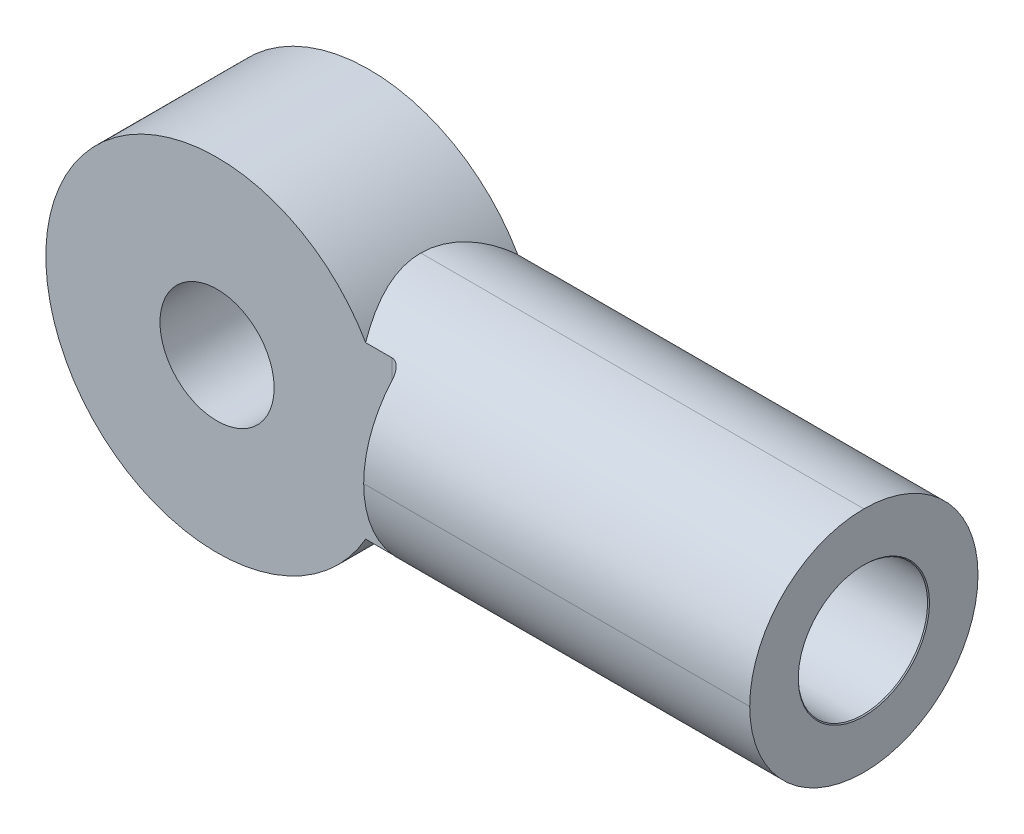
ISO-10303-21;
HEADER;
FILE_DESCRIPTION(('STEP AP214'),'2;1');
FILE_NAME('part.step','',(''),(''),'','','');
FILE_SCHEMA(('AUTOMOTIVE_DESIGN { 1 0 10303 214 1 1 1 1 }'));
ENDSEC;
DATA;
#1=APPLICATION_CONTEXT('core data for automotive mechanical design processes');
#2=APPLICATION_PROTOCOL_DEFINITION('international standard','automotive_design',2000,#1);
#3=PRODUCT_CONTEXT('',#1,'mechanical');
#4=PRODUCT('Part','Part','',(#3));
#5=PRODUCT_RELATED_PRODUCT_CATEGORY('part','',(#4));
#6=PRODUCT_DEFINITION_FORMATION('','',#4);
#7=PRODUCT_DEFINITION_CONTEXT('part definition',#1,'design');
#8=PRODUCT_DEFINITION('design','',#6,#7);
#9=PRODUCT_DEFINITION_SHAPE('','',#8);
#10=(LENGTH_UNIT() NAMED_UNIT(*) SI_UNIT(.MILLI.,.METRE.));
#11=(NAMED_UNIT(*) PLANE_ANGLE_UNIT() SI_UNIT($,.RADIAN.));
#12=(NAMED_UNIT(*) SI_UNIT($,.STERADIAN.) SOLID_ANGLE_UNIT());
#13=UNCERTAINTY_MEASURE_WITH_UNIT(LENGTH_MEASURE(1.E-05),#10,'distance_accuracy_value','');
#14=(GEOMETRIC_REPRESENTATION_CONTEXT(3) GLOBAL_UNCERTAINTY_ASSIGNED_CONTEXT((#13)) GLOBAL_UNIT_ASSIGNED_CONTEXT((#10,
#11,#12)) REPRESENTATION_CONTEXT('',''));
#15=CARTESIAN_POINT('',(0.,0.,0.));
#16=DIRECTION('',(0.,0.,1.));
#17=DIRECTION('',(1.,0.,0.));
#18=AXIS2_PLACEMENT_3D('',#15,#16,#17);
#19=CARTESIAN_POINT('',(0.,0.,6.));
#20=DIRECTION('',(0.,0.,-1.));
#21=DIRECTION('',(-1.,0.,0.));
#22=AXIS2_PLACEMENT_3D('',#19,#20,#21);
#23=CYLINDRICAL_SURFACE('',#22,4.5);
#24=CARTESIAN_POINT('',(0.,0.,1.));
#25=DIRECTION('',(0.,0.,-1.));
#26=DIRECTION('',(-1.,0.,0.));
#27=AXIS2_PLACEMENT_3D('',#24,#25,#26);
#28=CIRCLE('',#27,4.5);
#29=CARTESIAN_POINT('',(3.90512483795332,-2.23606797749979,1.));
#30=VERTEX_POINT('',#29);
#31=CARTESIAN_POINT('',(3.90512483795332,2.23606797749979,1.));
#32=VERTEX_POINT('',#31);
#33=EDGE_CURVE('E135',#30,#32,#28,.T.);
#34=ORIENTED_EDGE('',*,*,#33,.F.);
#35=CARTESIAN_POINT('',(3.90512483795332,-2.23606797749979,1.));
#36=CARTESIAN_POINT('',(3.87430248363081,-2.28990152814688,1.06021097202553));
#37=CARTESIAN_POINT('',(3.84340433414663,-2.3412741824826,1.12251861210551));
#38=CARTESIAN_POINT('',(3.78214828029025,-2.43899226804182,1.25131912936951));
#39=CARTESIAN_POINT('',(3.75179095016979,-2.48533259418797,1.31781615044173));
#40=CARTESIAN_POINT('',(3.66210321766203,-2.61731713514297,1.52468528722313));
#41=CARTESIAN_POINT('',(3.60476747014611,-2.6949001467601,1.67129505511275));
#42=CARTESIAN_POINT('',(3.51242978153191,-2.81379502124337,1.95063380048268));
#43=CARTESIAN_POINT('',(3.47525883130887,-2.85915891224902,2.08092816257066));
#44=CARTESIAN_POINT('',(3.41426811351215,-2.93173203603866,2.34885401161128));
#45=CARTESIAN_POINT('',(3.39036629206293,-2.95905304662755,2.48643450948373));
#46=CARTESIAN_POINT('',(3.36804353651592,-2.98435520758396,2.68772903446459));
#47=CARTESIAN_POINT('',(3.36284662191855,-2.99020103959435,2.7498104304557));
#48=CARTESIAN_POINT('',(3.3558646642643,-2.99803063464936,2.87458147311398));
#49=CARTESIAN_POINT('',(3.35408925235831,-3.00000349600086,2.93727233897236));
#50=CARTESIAN_POINT('',(3.35410196624968,-3.,3.));
#51=B_SPLINE_CURVE_WITH_KNOTS('',3,(#35,#36,#37,#38,#39,#40,#41,#42,#43,#44,#45,#46,#47,#48,#49,
#50),.UNSPECIFIED.,.F.,.F.,(4,2,2,2,2,2,2,4),(0.,0.259192052303657,0.518644634574339,
1.0424505897874,1.46954941047818,1.89397684264271,2.08150715622094,2.26956458020267),.UNSPECIFIED.);
#52=CARTESIAN_POINT('',(3.35410196624968,-3.,3.));
#53=VERTEX_POINT('',#52);
#54=EDGE_CURVE('E177',#30,#53,#51,.T.);
#55=ORIENTED_EDGE('',*,*,#54,.T.);
#56=CARTESIAN_POINT('',(3.35410196624968,-3.,3.));
#57=CARTESIAN_POINT('',(3.35406133264124,-3.0000192740159,3.07374160363224));
#58=CARTESIAN_POINT('',(3.35653275849281,-2.99728197493711,3.14745806667561));
#59=CARTESIAN_POINT('',(3.36618733199912,-2.9864488408589,3.29409104298593));
#60=CARTESIAN_POINT('',(3.37336425537169,-2.97836008446859,3.36700848380756));
#61=CARTESIAN_POINT('',(3.39202769480024,-2.9570819405099,3.51078892742276));
#62=CARTESIAN_POINT('',(3.40347159634914,-2.94394295107167,3.5816650169798));
#63=CARTESIAN_POINT('',(3.43015977984038,-2.91280377718486,3.72160692841399));
#64=CARTESIAN_POINT('',(3.44540509067008,-2.89480227654162,3.79067225458879));
#65=CARTESIAN_POINT('',(3.49579062406979,-2.83411412242887,3.99382096509364));
#66=CARTESIAN_POINT('',(3.53570725678305,-2.78460861981225,4.12473745273625));
#67=CARTESIAN_POINT('',(3.62363754406646,-2.6691774009434,4.3765059287876));
#68=CARTESIAN_POINT('',(3.67167461758368,-2.60320392183895,4.4973272528491));
#69=CARTESIAN_POINT('',(3.75141446899956,-2.48590317502807,4.6813533648933));
#70=CARTESIAN_POINT('',(3.78191749005986,-2.43935515287485,4.74818918579343));
#71=CARTESIAN_POINT('',(3.84335262840594,-2.3413619099754,4.87737899798922));
#72=CARTESIAN_POINT('',(3.87428195110304,-2.28994150579089,4.93975313266782));
#73=CARTESIAN_POINT('',(3.90512483795333,-2.23606797749979,5.));
#74=B_SPLINE_CURVE_WITH_KNOTS('',3,(#56,#57,#58,#59,#60,#61,#62,#63,#64,#65,#66,#67,#68,#69,#70,
#71,#72,#73),.UNSPECIFIED.,.F.,.F.,(4,2,2,2,2,2,2,2,4),(0.,0.221092162055901,0.441892458879527,
0.660544234322296,0.879255254295149,1.31401306963559,1.75004679072101,2.01073314368504,
2.27015661919764),.UNSPECIFIED.);
#75=CARTESIAN_POINT('',(3.90512483795333,-2.23606797749979,5.));
#76=VERTEX_POINT('',#75);
#77=EDGE_CURVE('E168',#53,#76,#74,.T.);
#78=ORIENTED_EDGE('',*,*,#77,.T.);
#79=CARTESIAN_POINT('',(0.,0.,5.));
#80=DIRECTION('',(0.,0.,1.));
#81=DIRECTION('',(1.,0.,0.));
#82=AXIS2_PLACEMENT_3D('',#79,#80,#81);
#83=CIRCLE('',#82,4.5);
#84=CARTESIAN_POINT('',(3.90512483795333,2.23606797749979,5.));
#85=VERTEX_POINT('',#84);
#86=EDGE_CURVE('E137',#85,#76,#83,.T.);
#87=ORIENTED_EDGE('',*,*,#86,.F.);
#88=CARTESIAN_POINT('',(3.90512483795333,2.23606797749979,5.));
#89=CARTESIAN_POINT('',(3.87430248363081,2.28990152814687,4.93978902797447));
#90=CARTESIAN_POINT('',(3.84340433414664,2.34127418248259,4.87748138789449));
#91=CARTESIAN_POINT('',(3.78214828029026,2.43899226804181,4.74868087063049));
#92=CARTESIAN_POINT('',(3.7517909501698,2.48533259418797,4.68218384955827));
#93=CARTESIAN_POINT('',(3.66210321766203,2.61731713514296,4.47531471277687));
#94=CARTESIAN_POINT('',(3.60476747014612,2.69490014676009,4.32870494488725));
#95=CARTESIAN_POINT('',(3.51242978153192,2.81379502124337,4.04936619951732));
#96=CARTESIAN_POINT('',(3.47525883130887,2.85915891224901,3.91907183742934));
#97=CARTESIAN_POINT('',(3.41426811351216,2.93173203603865,3.65114598838872));
#98=CARTESIAN_POINT('',(3.39036629206293,2.95905304662754,3.51356549051627));
#99=CARTESIAN_POINT('',(3.36804353651592,2.98435520758395,3.31227096553541));
#100=CARTESIAN_POINT('',(3.36284662191855,2.99020103959434,3.2501895695443));
#101=CARTESIAN_POINT('',(3.35586466426431,2.99803063464935,3.12541852688602));
#102=CARTESIAN_POINT('',(3.35408925235832,3.00000349600085,3.06272766102764));
#103=CARTESIAN_POINT('',(3.35410196624969,3.,3.));
#104=B_SPLINE_CURVE_WITH_KNOTS('',3,(#88,#89,#90,#91,#92,#93,#94,#95,#96,#97,#98,#99,#100,#101,
#102,#103),.UNSPECIFIED.,.F.,.F.,(4,2,2,2,2,2,2,4),(0.,0.259192052303656,0.51864463457434,
1.0424505897874,1.46954941047818,1.89397684264271,2.08150715622094,2.26956458020267),.UNSPECIFIED.);
#105=CARTESIAN_POINT('',(3.35410196624968,3.,3.));
#106=VERTEX_POINT('',#105);
#107=EDGE_CURVE('E237',#85,#106,#104,.T.);
#108=ORIENTED_EDGE('',*,*,#107,.T.);
#109=CARTESIAN_POINT('',(3.35410196624968,3.,3.));
#110=CARTESIAN_POINT('',(3.35406133264124,3.00001927401591,2.92625839636776));
#111=CARTESIAN_POINT('',(3.3565327584928,2.99728197493712,2.85254193332438));
#112=CARTESIAN_POINT('',(3.36618733199911,2.9864488408589,2.70590895701407));
#113=CARTESIAN_POINT('',(3.37336425537169,2.97836008446859,2.63299151619244));
#114=CARTESIAN_POINT('',(3.39202769480023,2.95708194050991,2.48921107257724));
#115=CARTESIAN_POINT('',(3.40347159634914,2.94394295107168,2.4183349830202));
#116=CARTESIAN_POINT('',(3.43015977984038,2.91280377718486,2.27839307158601));
#117=CARTESIAN_POINT('',(3.44540509067007,2.89480227654162,2.20932774541121));
#118=CARTESIAN_POINT('',(3.49579062406979,2.83411412242888,2.00617903490636));
#119=CARTESIAN_POINT('',(3.53570725678305,2.78460861981226,1.87526254726375));
#120=CARTESIAN_POINT('',(3.62363754406645,2.6691774009434,1.6234940712124));
#121=CARTESIAN_POINT('',(3.67167461758368,2.60320392183895,1.5026727471509));
#122=CARTESIAN_POINT('',(3.75141446899955,2.48590317502808,1.3186466351067));
#123=CARTESIAN_POINT('',(3.78191749005986,2.43935515287486,1.25181081420657));
#124=CARTESIAN_POINT('',(3.84335262840594,2.34136190997541,1.12262100201078));
#125=CARTESIAN_POINT('',(3.87428195110303,2.2899415057909,1.06024686733218));
#126=CARTESIAN_POINT('',(3.90512483795332,2.23606797749979,1.));
#127=B_SPLINE_CURVE_WITH_KNOTS('',3,(#109,#110,#111,#112,#113,#114,#115,#116,#117,#118,#119,
#120,#121,#122,#123,#124,#125,#126),.UNSPECIFIED.,.F.,.F.,(4,2,2,2,2,2,2,2,4),(0.,
0.221092162055902,0.441892458879527,0.660544234322296,0.879255254295149,1.31401306963559,
1.75004679072101,2.01073314368504,2.27015661919764),.UNSPECIFIED.);
#128=EDGE_CURVE('E226',#106,#32,#127,.T.);
#129=ORIENTED_EDGE('',*,*,#128,.T.);
#130=EDGE_LOOP('',(#34,#55,#78,#87,#108,#129));
#131=FACE_BOUND('',#130,.T.);
#132=ADVANCED_FACE('F36',(#131),#23,.T.);
#133=CARTESIAN_POINT('',(15.,3.,6.));
#134=DIRECTION('',(-1.,0.,0.));
#135=DIRECTION('',(0.,0.,1.));
#136=AXIS2_PLACEMENT_3D('',#133,#134,#135);
#137=PLANE('',#136);
#138=CARTESIAN_POINT('',(15.,0.,3.));
#139=DIRECTION('',(1.,0.,0.));
#140=DIRECTION('',(0.,0.,-1.));
#141=AXIS2_PLACEMENT_3D('',#138,#139,#140);
#142=CIRCLE('',#141,1.725);
#143=CARTESIAN_POINT('',(15.,0.,1.275));
#144=VERTEX_POINT('',#143);
#145=EDGE_CURVE('E131',#144,#144,#142,.T.);
#146=ORIENTED_EDGE('',*,*,#145,.F.);
#147=EDGE_LOOP('',(#146));
#148=FACE_BOUND('',#147,.T.);
#149=CARTESIAN_POINT('',(15.,0.,3.));
#150=DIRECTION('',(-1.,0.,0.));
#151=DIRECTION('',(0.,0.,1.));
#152=AXIS2_PLACEMENT_3D('',#149,#150,#151);
#153=CIRCLE('',#152,3.);
#154=CARTESIAN_POINT('',(15.,3.,3.));
#155=VERTEX_POINT('',#154);
#156=CARTESIAN_POINT('',(15.,0.,6.));
#157=VERTEX_POINT('',#156);
#158=EDGE_CURVE('E140',#155,#157,#153,.F.);
#159=ORIENTED_EDGE('',*,*,#158,.T.);
#160=CARTESIAN_POINT('',(15.,0.,3.));
#161=DIRECTION('',(-1.,0.,0.));
#162=DIRECTION('',(0.,0.,1.));
#163=AXIS2_PLACEMENT_3D('',#160,#161,#162);
#164=CIRCLE('',#163,3.);
#165=CARTESIAN_POINT('',(15.,-3.,3.));
#166=VERTEX_POINT('',#165);
#167=EDGE_CURVE('E146',#157,#166,#164,.F.);
#168=ORIENTED_EDGE('',*,*,#167,.T.);
#169=CARTESIAN_POINT('',(15.,0.,3.));
#170=DIRECTION('',(-1.,0.,0.));
#171=DIRECTION('',(0.,0.,1.));
#172=AXIS2_PLACEMENT_3D('',#169,#170,#171);
#173=CIRCLE('',#172,3.);
#174=CARTESIAN_POINT('',(15.,0.,0.));
#175=VERTEX_POINT('',#174);
#176=EDGE_CURVE('E144',#166,#175,#173,.F.);
#177=ORIENTED_EDGE('',*,*,#176,.T.);
#178=CARTESIAN_POINT('',(15.,0.,3.));
#179=DIRECTION('',(-1.,0.,0.));
#180=DIRECTION('',(0.,0.,1.));
#181=AXIS2_PLACEMENT_3D('',#178,#179,#180);
#182=CIRCLE('',#181,3.);
#183=EDGE_CURVE('E142',#175,#155,#182,.F.);
#184=ORIENTED_EDGE('',*,*,#183,.T.);
#185=EDGE_LOOP('',(#159,#168,#177,#184));
#186=FACE_BOUND('',#185,.T.);
#187=ADVANCED_FACE('F286',(#148,#186),#137,.F.);
#188=CARTESIAN_POINT('',(4.85410196624968,3.,5.));
#189=DIRECTION('',(1.,0.,0.));
#190=DIRECTION('',(0.,0.,-1.));
#191=AXIS2_PLACEMENT_3D('',#188,#189,#190);
#192=PLANE('',#191);
#193=CARTESIAN_POINT('',(4.85410196624968,0.,3.));
#194=DIRECTION('',(1.,0.,0.));
#195=DIRECTION('',(0.,0.,-1.));
#196=AXIS2_PLACEMENT_3D('',#193,#194,#195);
#197=CIRCLE('',#196,3.);
#198=CARTESIAN_POINT('',(4.85410196624968,0.,6.));
#199=VERTEX_POINT('',#198);
#200=CARTESIAN_POINT('',(4.85410196624968,1.98431348329844,5.25));
#201=VERTEX_POINT('',#200);
#202=EDGE_CURVE('E154',#199,#201,#197,.F.);
#203=ORIENTED_EDGE('',*,*,#202,.T.);
#204=DIRECTION('',(0.,1.,0.));
#205=VECTOR('',#204,1.);
#206=CARTESIAN_POINT('',(4.85410196624968,3.,5.25));
#207=LINE('',#206,#205);
#208=CARTESIAN_POINT('',(4.85410196624968,-1.98431348329844,5.25));
#209=VERTEX_POINT('',#208);
#210=EDGE_CURVE('E252',#201,#209,#207,.F.);
#211=ORIENTED_EDGE('',*,*,#210,.T.);
#212=CARTESIAN_POINT('',(4.85410196624968,0.,3.));
#213=DIRECTION('',(1.,0.,0.));
#214=DIRECTION('',(0.,0.,-1.));
#215=AXIS2_PLACEMENT_3D('',#212,#213,#214);
#216=CIRCLE('',#215,3.);
#217=EDGE_CURVE('E157',#209,#199,#216,.F.);
#218=ORIENTED_EDGE('',*,*,#217,.T.);
#219=EDGE_LOOP('',(#203,#211,#218));
#220=FACE_BOUND('',#219,.T.);
#221=ADVANCED_FACE('F264',(#220),#192,.F.);
#222=CARTESIAN_POINT('',(0.,0.,5.));
#223=DIRECTION('',(0.,0.,1.));
#224=DIRECTION('',(1.,0.,0.));
#225=AXIS2_PLACEMENT_3D('',#222,#223,#224);
#226=PLANE('',#225);
#227=CARTESIAN_POINT('',(0.,0.,5.));
#228=DIRECTION('',(0.,0.,1.));
#229=DIRECTION('',(1.,0.,0.));
#230=AXIS2_PLACEMENT_3D('',#227,#228,#229);
#231=CIRCLE('',#230,1.5);
#232=CARTESIAN_POINT('',(1.5,0.,5.));
#233=VERTEX_POINT('',#232);
#234=EDGE_CURVE('E321',#233,#233,#231,.T.);
#235=ORIENTED_EDGE('',*,*,#234,.F.);
#236=EDGE_LOOP('',(#235));
#237=FACE_BOUND('',#236,.T.);
#238=DIRECTION('',(-1.,0.,0.));
#239=VECTOR('',#238,1.);
#240=CARTESIAN_POINT('',(3.90512483795333,-2.23606797749979,5.));
#241=LINE('',#240,#239);
#242=CARTESIAN_POINT('',(4.60410196624968,-2.23606797749979,5.));
#243=VERTEX_POINT('',#242);
#244=EDGE_CURVE('E151',#76,#243,#241,.F.);
#245=ORIENTED_EDGE('',*,*,#244,.T.);
#246=DIRECTION('',(0.,1.,0.));
#247=VECTOR('',#246,1.);
#248=CARTESIAN_POINT('',(4.60410196624968,0.,5.));
#249=LINE('',#248,#247);
#250=CARTESIAN_POINT('',(4.60410196624968,2.23606797749979,5.));
#251=VERTEX_POINT('',#250);
#252=EDGE_CURVE('E242',#243,#251,#249,.T.);
#253=ORIENTED_EDGE('',*,*,#252,.T.);
#254=DIRECTION('',(1.,0.,0.));
#255=VECTOR('',#254,1.);
#256=CARTESIAN_POINT('',(4.85410196624968,2.23606797749979,5.));
#257=LINE('',#256,#255);
#258=EDGE_CURVE('E149',#251,#85,#257,.F.);
#259=ORIENTED_EDGE('',*,*,#258,.T.);
#260=ORIENTED_EDGE('',*,*,#86,.T.);
#261=EDGE_LOOP('',(#245,#253,#259,#260));
#262=FACE_BOUND('',#261,.T.);
#263=ADVANCED_FACE('F270',(#237,#262),#226,.T.);
#264=CARTESIAN_POINT('',(4.85410196624968,3.,1.));
#265=DIRECTION('',(1.,0.,0.));
#266=DIRECTION('',(0.,0.,-1.));
#267=AXIS2_PLACEMENT_3D('',#264,#265,#266);
#268=PLANE('',#267);
#269=CARTESIAN_POINT('',(4.85410196624968,0.,3.));
#270=DIRECTION('',(1.,0.,0.));
#271=DIRECTION('',(0.,0.,-1.));
#272=AXIS2_PLACEMENT_3D('',#269,#270,#271);
#273=CIRCLE('',#272,3.);
#274=CARTESIAN_POINT('',(4.85410196624968,0.,0.));
#275=VERTEX_POINT('',#274);
#276=CARTESIAN_POINT('',(4.85410196624968,-1.98431348329845,0.75));
#277=VERTEX_POINT('',#276);
#278=EDGE_CURVE('E166',#275,#277,#273,.F.);
#279=ORIENTED_EDGE('',*,*,#278,.T.);
#280=DIRECTION('',(0.,-1.,0.));
#281=VECTOR('',#280,1.);
#282=CARTESIAN_POINT('',(4.85410196624968,3.,0.75));
#283=LINE('',#282,#281);
#284=CARTESIAN_POINT('',(4.85410196624968,1.98431348329845,0.75));
#285=VERTEX_POINT('',#284);
#286=EDGE_CURVE('E59',#277,#285,#283,.F.);
#287=ORIENTED_EDGE('',*,*,#286,.T.);
#288=CARTESIAN_POINT('',(4.85410196624968,0.,3.));
#289=DIRECTION('',(1.,0.,0.));
#290=DIRECTION('',(0.,0.,-1.));
#291=AXIS2_PLACEMENT_3D('',#288,#289,#290);
#292=CIRCLE('',#291,3.);
#293=EDGE_CURVE('E164',#285,#275,#292,.F.);
#294=ORIENTED_EDGE('',*,*,#293,.T.);
#295=EDGE_LOOP('',(#279,#287,#294));
#296=FACE_BOUND('',#295,.T.);
#297=ADVANCED_FACE('F298',(#296),#268,.F.);
#298=CARTESIAN_POINT('',(0.,0.,1.));
#299=DIRECTION('',(0.,0.,-1.));
#300=DIRECTION('',(-1.,0.,0.));
#301=AXIS2_PLACEMENT_3D('',#298,#299,#300);
#302=PLANE('',#301);
#303=CARTESIAN_POINT('',(0.,0.,1.));
#304=DIRECTION('',(0.,0.,-1.));
#305=DIRECTION('',(-1.,0.,0.));
#306=AXIS2_PLACEMENT_3D('',#303,#304,#305);
#307=CIRCLE('',#306,1.5);
#308=CARTESIAN_POINT('',(-1.5,0.,1.));
#309=VERTEX_POINT('',#308);
#310=EDGE_CURVE('E41',#309,#309,#307,.T.);
#311=ORIENTED_EDGE('',*,*,#310,.F.);
#312=EDGE_LOOP('',(#311));
#313=FACE_BOUND('',#312,.T.);
#314=DIRECTION('',(-1.,0.,0.));
#315=VECTOR('',#314,1.);
#316=CARTESIAN_POINT('',(3.90512483795332,2.23606797749979,1.));
#317=LINE('',#316,#315);
#318=CARTESIAN_POINT('',(4.60410196624968,2.23606797749979,1.));
#319=VERTEX_POINT('',#318);
#320=EDGE_CURVE('E159',#32,#319,#317,.F.);
#321=ORIENTED_EDGE('',*,*,#320,.T.);
#322=DIRECTION('',(0.,-1.,0.));
#323=VECTOR('',#322,1.);
#324=CARTESIAN_POINT('',(4.60410196624968,0.,1.));
#325=LINE('',#324,#323);
#326=CARTESIAN_POINT('',(4.60410196624968,-2.23606797749979,1.));
#327=VERTEX_POINT('',#326);
#328=EDGE_CURVE('E254',#319,#327,#325,.T.);
#329=ORIENTED_EDGE('',*,*,#328,.T.);
#330=DIRECTION('',(1.,0.,0.));
#331=VECTOR('',#330,1.);
#332=CARTESIAN_POINT('',(4.85410196624968,-2.23606797749979,1.));
#333=LINE('',#332,#331);
#334=EDGE_CURVE('E162',#327,#30,#333,.F.);
#335=ORIENTED_EDGE('',*,*,#334,.T.);
#336=ORIENTED_EDGE('',*,*,#33,.T.);
#337=EDGE_LOOP('',(#321,#329,#335,#336));
#338=FACE_BOUND('',#337,.T.);
#339=ADVANCED_FACE('F222',(#313,#338),#302,.T.);
#340=CARTESIAN_POINT('',(3.35410196624968,0.,3.));
#341=DIRECTION('',(-1.,0.,0.));
#342=DIRECTION('',(0.,-1.,0.));
#343=AXIS2_PLACEMENT_3D('',#340,#341,#342);
#344=CYLINDRICAL_SURFACE('',#343,3.);
#345=DIRECTION('',(-1.,0.,0.));
#346=VECTOR('',#345,1.);
#347=CARTESIAN_POINT('',(3.35410196624968,3.,3.));
#348=LINE('',#347,#346);
#349=EDGE_CURVE('E245',#155,#106,#348,.T.);
#350=ORIENTED_EDGE('',*,*,#349,.F.);
#351=ORIENTED_EDGE('',*,*,#183,.F.);
#352=DIRECTION('',(-1.,0.,0.));
#353=VECTOR('',#352,1.);
#354=CARTESIAN_POINT('',(0.,0.,0.));
#355=LINE('',#354,#353);
#356=EDGE_CURVE('E138',#275,#175,#355,.F.);
#357=ORIENTED_EDGE('',*,*,#356,.F.);
#358=ORIENTED_EDGE('',*,*,#293,.F.);
#359=CARTESIAN_POINT('',(4.85410196624968,1.98431348329845,0.75));
#360=CARTESIAN_POINT('',(4.85406798169426,2.00563153099554,0.768768417275098));
#361=CARTESIAN_POINT('',(4.85197271850851,2.02679836237443,0.788004786930665));
#362=CARTESIAN_POINT('',(4.84288766100713,2.06826100416527,0.826737187080204));
#363=CARTESIAN_POINT('',(4.83583914225797,2.08854323116171,0.846233551229339));
#364=CARTESIAN_POINT('',(4.81986706117423,2.11965967595475,0.876953501898617));
#365=CARTESIAN_POINT('',(4.81272130559071,2.13111559247635,0.888461940240052));
#366=CARTESIAN_POINT('',(4.79608950709745,2.15294649617548,0.910727180071933));
#367=CARTESIAN_POINT('',(4.78661266865348,2.16332551175998,0.921486729242686));
#368=CARTESIAN_POINT('',(4.76735940740052,2.18065946056562,0.939696749410038));
#369=CARTESIAN_POINT('',(4.75803966140018,2.18788074448789,0.947374197860408));
#370=CARTESIAN_POINT('',(4.73781071693292,2.20114012216966,0.961599545513657));
#371=CARTESIAN_POINT('',(4.72690252668316,2.20717896079214,0.968148155497589));
#372=CARTESIAN_POINT('',(4.70570084471154,2.21681836625724,0.978674150017823));
#373=CARTESIAN_POINT('',(4.69564235591201,2.22066150444522,0.98290163776295));
#374=CARTESIAN_POINT('',(4.67472175049345,2.22715355873041,0.990072018821529));
#375=CARTESIAN_POINT('',(4.66386114175821,2.22980465238241,0.993017254160838));
#376=CARTESIAN_POINT('',(4.64482311076331,2.23319671043753,0.996793297156466));
#377=CARTESIAN_POINT('',(4.63677463262436,2.23426799383409,0.997988873028011));
#378=CARTESIAN_POINT('',(4.62052064837459,2.23570603540597,0.999595333192012));
#379=CARTESIAN_POINT('',(4.61231484170574,2.23607127301958,1.00000452389032));
#380=CARTESIAN_POINT('',(4.60410196624968,2.23606797749979,1.));
#381=B_SPLINE_CURVE_WITH_KNOTS('',3,(#359,#360,#361,#362,#363,#364,#365,#366,#367,#368,#369,
#370,#371,#372,#373,#374,#375,#376,#377,#378,#379,#380),.UNSPECIFIED.,.F.,.F.,(4,2,2,2,2,2,2,2,
2,2,4),(0.,0.0854568128666462,0.171944254844597,0.225002188827575,0.277853890931741,
0.319908968411425,0.361937468115426,0.396500290023887,0.430999715572218,0.455554819737186,
0.48016274786504),.UNSPECIFIED.);
#382=EDGE_CURVE('E11',#285,#319,#381,.T.);
#383=ORIENTED_EDGE('',*,*,#382,.T.);
#384=ORIENTED_EDGE('',*,*,#320,.F.);
#385=ORIENTED_EDGE('',*,*,#128,.F.);
#386=EDGE_LOOP('',(#350,#351,#357,#358,#383,#384,#385));
#387=FACE_BOUND('',#386,.T.);
#388=ADVANCED_FACE('F217',(#387),#344,.T.);
#389=CARTESIAN_POINT('',(3.35410196624968,0.,3.));
#390=DIRECTION('',(1.,0.,0.));
#391=DIRECTION('',(0.,1.,0.));
#392=AXIS2_PLACEMENT_3D('',#389,#390,#391);
#393=CYLINDRICAL_SURFACE('',#392,3.);
#394=ORIENTED_EDGE('',*,*,#356,.T.);
#395=ORIENTED_EDGE('',*,*,#176,.F.);
#396=DIRECTION('',(1.,0.,0.));
#397=VECTOR('',#396,1.);
#398=CARTESIAN_POINT('',(3.35410196624968,-3.,3.));
#399=LINE('',#398,#397);
#400=EDGE_CURVE('E128',#53,#166,#399,.T.);
#401=ORIENTED_EDGE('',*,*,#400,.F.);
#402=ORIENTED_EDGE('',*,*,#54,.F.);
#403=ORIENTED_EDGE('',*,*,#334,.F.);
#404=CARTESIAN_POINT('',(4.60410196624968,-2.23606797749979,1.));
#405=CARTESIAN_POINT('',(4.61556796991067,-2.23608188280688,1.00001852053253));
#406=CARTESIAN_POINT('',(4.62701234275867,-2.23536361526596,0.999212448369325));
#407=CARTESIAN_POINT('',(4.64944907251483,-2.23258114963307,0.996106598656395));
#408=CARTESIAN_POINT('',(4.66044403715663,-2.23052642869236,0.993817339230522));
#409=CARTESIAN_POINT('',(4.68172303501368,-2.22519163655921,0.987902366001335));
#410=CARTESIAN_POINT('',(4.69200837826784,-2.22191389903517,0.984279197637059));
#411=CARTESIAN_POINT('',(4.71170302625167,-2.21429536843718,0.975912967626595));
#412=CARTESIAN_POINT('',(4.72111074420931,-2.20995269945974,0.971167930314925));
#413=CARTESIAN_POINT('',(4.74188989562942,-2.19877806076572,0.95905342438175));
#414=CARTESIAN_POINT('',(4.75287173112517,-2.19159873650058,0.951336230305094));
#415=CARTESIAN_POINT('',(4.7729761889517,-2.17602495554593,0.934801437726774));
#416=CARTESIAN_POINT('',(4.78209628737194,-2.16762887533678,0.925982371196913));
#417=CARTESIAN_POINT('',(4.80149065511814,-2.14673514750091,0.904331423352832));
#418=CARTESIAN_POINT('',(4.81100306306182,-2.13384741874312,0.891195896300298));
#419=CARTESIAN_POINT('',(4.8270134650202,-2.10689570336753,0.864266697523148));
#420=CARTESIAN_POINT('',(4.83350135620408,-2.09282795712645,0.850470987374959));
#421=CARTESIAN_POINT('',(4.84398849276521,-2.06326638139751,0.822072429515224));
#422=CARTESIAN_POINT('',(4.84786133535387,-2.04773680140142,0.807461379540417));
#423=CARTESIAN_POINT('',(4.8528982715146,-2.01628128787871,0.778497748136431));
#424=CARTESIAN_POINT('',(4.85408801358394,-2.00036059092853,0.764144031975542));
#425=CARTESIAN_POINT('',(4.85410196625707,-1.98431348329989,0.750000000001222));
#426=B_SPLINE_CURVE_WITH_KNOTS('',3,(#404,#405,#406,#407,#408,#409,#410,#411,#412,#413,#414,
#415,#416,#417,#418,#419,#420,#421,#422,#423,#424,#425),.UNSPECIFIED.,.F.,.F.,(4,2,2,2,2,2,2,2,
2,2,4),(0.,0.0343130203843341,0.0683853323414333,0.102392959807166,0.136460928390982,
0.181875928091679,0.227352092777359,0.289160954755772,0.351174823868433,0.416005043166053,
0.480212857219239),.UNSPECIFIED.);
#427=EDGE_CURVE('E46',#327,#277,#426,.T.);
#428=ORIENTED_EDGE('',*,*,#427,.T.);
#429=ORIENTED_EDGE('',*,*,#278,.F.);
#430=EDGE_LOOP('',(#394,#395,#401,#402,#403,#428,#429));
#431=FACE_BOUND('',#430,.T.);
#432=ADVANCED_FACE('F221',(#431),#393,.T.);
#433=CARTESIAN_POINT('',(0.,0.,3.));
#434=DIRECTION('',(1.,0.,0.));
#435=DIRECTION('',(0.,1.,0.));
#436=AXIS2_PLACEMENT_3D('',#433,#434,#435);
#437=CYLINDRICAL_SURFACE('',#436,3.);
#438=ORIENTED_EDGE('',*,*,#258,.F.);
#439=CARTESIAN_POINT('',(4.60410196624968,2.23606797749979,5.));
#440=CARTESIAN_POINT('',(4.61556796991067,2.23608188280687,4.99998147946747));
#441=CARTESIAN_POINT('',(4.62701234275867,2.23536361526595,5.00078755163068));
#442=CARTESIAN_POINT('',(4.64944907251483,2.23258114963307,5.00389340134361));
#443=CARTESIAN_POINT('',(4.66044403715663,2.23052642869235,5.00618266076948));
#444=CARTESIAN_POINT('',(4.68172303501368,2.2251916365592,5.01209763399866));
#445=CARTESIAN_POINT('',(4.69200837826784,2.22191389903516,5.01572080236294));
#446=CARTESIAN_POINT('',(4.71170302625167,2.21429536843718,5.02408703237341));
#447=CARTESIAN_POINT('',(4.72111074420931,2.20995269945973,5.02883206968508));
#448=CARTESIAN_POINT('',(4.74188989562942,2.19877806076572,5.04094657561825));
#449=CARTESIAN_POINT('',(4.75287173112517,2.19159873650057,5.04866376969491));
#450=CARTESIAN_POINT('',(4.7729761889517,2.17602495554593,5.06519856227323));
#451=CARTESIAN_POINT('',(4.78209628737194,2.16762887533677,5.07401762880309));
#452=CARTESIAN_POINT('',(4.80149065511814,2.1467351475009,5.09566857664717));
#453=CARTESIAN_POINT('',(4.81100306306182,2.13384741874311,5.1088041036997));
#454=CARTESIAN_POINT('',(4.8270134650202,2.10689570336752,5.13573330247685));
#455=CARTESIAN_POINT('',(4.83350135620408,2.09282795712645,5.14952901262504));
#456=CARTESIAN_POINT('',(4.84398849276521,2.0632663813975,5.17792757048478));
#457=CARTESIAN_POINT('',(4.84786133535387,2.04773680140141,5.19253862045958));
#458=CARTESIAN_POINT('',(4.8528982715146,2.0162812878787,5.22150225186357));
#459=CARTESIAN_POINT('',(4.85408801358393,2.00036059092852,5.23585596802446));
#460=CARTESIAN_POINT('',(4.85410196625707,1.98431348329989,5.24999999999878));
#461=B_SPLINE_CURVE_WITH_KNOTS('',3,(#439,#440,#441,#442,#443,#444,#445,#446,#447,#448,#449,
#450,#451,#452,#453,#454,#455,#456,#457,#458,#459,#460),.UNSPECIFIED.,.F.,.F.,(4,2,2,2,2,2,2,2,
2,2,4),(0.,0.0343130203843341,0.0683853323414332,0.102392959807166,0.136460928390982,
0.18187592809168,0.22735209277736,0.289160954755774,0.351174823868436,0.416005043166054,
0.480212857219239),.UNSPECIFIED.);
#462=EDGE_CURVE('E203',#251,#201,#461,.T.);
#463=ORIENTED_EDGE('',*,*,#462,.T.);
#464=ORIENTED_EDGE('',*,*,#202,.F.);
#465=DIRECTION('',(-1.,0.,0.));
#466=VECTOR('',#465,1.);
#467=CARTESIAN_POINT('',(4.85410196624968,0.,6.));
#468=LINE('',#467,#466);
#469=EDGE_CURVE('E124',#157,#199,#468,.T.);
#470=ORIENTED_EDGE('',*,*,#469,.F.);
#471=ORIENTED_EDGE('',*,*,#158,.F.);
#472=ORIENTED_EDGE('',*,*,#349,.T.);
#473=ORIENTED_EDGE('',*,*,#107,.F.);
#474=EDGE_LOOP('',(#438,#463,#464,#470,#471,#472,#473));
#475=FACE_BOUND('',#474,.T.);
#476=ADVANCED_FACE('F191',(#475),#437,.T.);
#477=CARTESIAN_POINT('',(0.,0.,3.));
#478=DIRECTION('',(-1.,0.,0.));
#479=DIRECTION('',(0.,-1.,0.));
#480=AXIS2_PLACEMENT_3D('',#477,#478,#479);
#481=CYLINDRICAL_SURFACE('',#480,3.);
#482=ORIENTED_EDGE('',*,*,#77,.F.);
#483=ORIENTED_EDGE('',*,*,#400,.T.);
#484=ORIENTED_EDGE('',*,*,#167,.F.);
#485=ORIENTED_EDGE('',*,*,#469,.T.);
#486=ORIENTED_EDGE('',*,*,#217,.F.);
#487=CARTESIAN_POINT('',(4.85410196624968,-1.98431348329844,5.25));
#488=CARTESIAN_POINT('',(4.85406798169426,-2.00563153099554,5.2312315827249));
#489=CARTESIAN_POINT('',(4.85197271850851,-2.02679836237443,5.21199521306934));
#490=CARTESIAN_POINT('',(4.84288766100713,-2.06826100416527,5.1732628129198));
#491=CARTESIAN_POINT('',(4.83583914225797,-2.0885432311617,5.15376644877066));
#492=CARTESIAN_POINT('',(4.81986706117423,-2.11965967595474,5.12304649810138));
#493=CARTESIAN_POINT('',(4.81272130559071,-2.13111559247635,5.11153805975995));
#494=CARTESIAN_POINT('',(4.79608950709745,-2.15294649617547,5.08927281992807));
#495=CARTESIAN_POINT('',(4.78661266865347,-2.16332551175997,5.07851327075731));
#496=CARTESIAN_POINT('',(4.76735940740052,-2.18065946056561,5.06030325058996));
#497=CARTESIAN_POINT('',(4.75803966140018,-2.18788074448788,5.05262580213959));
#498=CARTESIAN_POINT('',(4.73781071693292,-2.20114012216965,5.03840045448634));
#499=CARTESIAN_POINT('',(4.72690252668316,-2.20717896079213,5.03185184450241));
#500=CARTESIAN_POINT('',(4.70570084471154,-2.21681836625723,5.02132584998218));
#501=CARTESIAN_POINT('',(4.69564235591201,-2.22066150444522,5.01709836223705));
#502=CARTESIAN_POINT('',(4.67472175049345,-2.2271535587304,5.00992798117847));
#503=CARTESIAN_POINT('',(4.66386114175821,-2.2298046523824,5.00698274583916));
#504=CARTESIAN_POINT('',(4.64482311076332,-2.23319671043752,5.00320670284353));
#505=CARTESIAN_POINT('',(4.63677463262436,-2.23426799383408,5.00201112697199));
#506=CARTESIAN_POINT('',(4.62052064837459,-2.23570603540597,5.00040466680799));
#507=CARTESIAN_POINT('',(4.61231484170574,-2.23607127301957,4.99999547610968));
#508=CARTESIAN_POINT('',(4.60410196624968,-2.23606797749979,5.));
#509=B_SPLINE_CURVE_WITH_KNOTS('',3,(#487,#488,#489,#490,#491,#492,#493,#494,#495,#496,#497,
#498,#499,#500,#501,#502,#503,#504,#505,#506,#507,#508),.UNSPECIFIED.,.F.,.F.,(4,2,2,2,2,2,2,2,
2,2,4),(0.,0.0854568128666461,0.171944254844596,0.225002188827575,0.277853890931742,
0.319908968411426,0.361937468115426,0.396500290023886,0.430999715572218,0.455554819737185,
0.480162747865039),.UNSPECIFIED.);
#510=EDGE_CURVE('E196',#209,#243,#509,.T.);
#511=ORIENTED_EDGE('',*,*,#510,.T.);
#512=ORIENTED_EDGE('',*,*,#244,.F.);
#513=EDGE_LOOP('',(#482,#483,#484,#485,#486,#511,#512));
#514=FACE_BOUND('',#513,.T.);
#515=ADVANCED_FACE('F186',(#514),#481,.T.);
#516=CARTESIAN_POINT('',(4.60410196624968,0.,5.25));
#517=DIRECTION('',(0.,1.,0.));
#518=DIRECTION('',(0.,0.,1.));
#519=AXIS2_PLACEMENT_3D('',#516,#517,#518);
#520=CYLINDRICAL_SURFACE('',#519,0.25);
#521=ORIENTED_EDGE('',*,*,#510,.F.);
#522=ORIENTED_EDGE('',*,*,#210,.F.);
#523=ORIENTED_EDGE('',*,*,#462,.F.);
#524=ORIENTED_EDGE('',*,*,#252,.F.);
#525=EDGE_LOOP('',(#521,#522,#523,#524));
#526=FACE_BOUND('',#525,.T.);
#527=ADVANCED_FACE('F190',(#526),#520,.F.);
#528=CARTESIAN_POINT('',(4.60410196624968,0.,0.75));
#529=DIRECTION('',(0.,-1.,0.));
#530=DIRECTION('',(0.,0.,-1.));
#531=AXIS2_PLACEMENT_3D('',#528,#529,#530);
#532=CYLINDRICAL_SURFACE('',#531,0.25);
#533=ORIENTED_EDGE('',*,*,#382,.F.);
#534=ORIENTED_EDGE('',*,*,#286,.F.);
#535=ORIENTED_EDGE('',*,*,#427,.F.);
#536=ORIENTED_EDGE('',*,*,#328,.F.);
#537=EDGE_LOOP('',(#533,#534,#535,#536));
#538=FACE_BOUND('',#537,.T.);
#539=ADVANCED_FACE('F38',(#538),#532,.F.);
#540=CARTESIAN_POINT('',(10.,0.,3.));
#541=DIRECTION('',(1.,0.,0.));
#542=DIRECTION('',(0.,0.,-1.));
#543=AXIS2_PLACEMENT_3D('',#540,#541,#542);
#544=CONICAL_SURFACE('',#543,1.7,1.02974425867665);
#545=CARTESIAN_POINT('',(8.97853694765315,0.,3.));
#546=VERTEX_POINT('',#545);
#547=VERTEX_LOOP('',#546);
#548=FACE_BOUND('',#547,.T.);
#549=CARTESIAN_POINT('',(10.,0.,3.));
#550=DIRECTION('',(1.,0.,0.));
#551=DIRECTION('',(0.,0.,-1.));
#552=AXIS2_PLACEMENT_3D('',#549,#550,#551);
#553=CIRCLE('',#552,1.7);
#554=CARTESIAN_POINT('',(10.,0.,1.3));
#555=VERTEX_POINT('',#554);
#556=EDGE_CURVE('E122',#555,#555,#553,.T.);
#557=ORIENTED_EDGE('',*,*,#556,.T.);
#558=EDGE_LOOP('',(#557));
#559=FACE_BOUND('',#558,.T.);
#560=ADVANCED_FACE('F115',(#548,#559),#544,.F.);
#561=CARTESIAN_POINT('',(15.,0.,3.));
#562=DIRECTION('',(1.,0.,0.));
#563=DIRECTION('',(0.,0.,-1.));
#564=AXIS2_PLACEMENT_3D('',#561,#562,#563);
#565=CYLINDRICAL_SURFACE('',#564,1.7);
#566=ORIENTED_EDGE('',*,*,#556,.F.);
#567=EDGE_LOOP('',(#566));
#568=FACE_BOUND('',#567,.T.);
#569=CARTESIAN_POINT('',(14.975,0.,3.));
#570=DIRECTION('',(1.,0.,0.));
#571=DIRECTION('',(0.,0.,-1.));
#572=AXIS2_PLACEMENT_3D('',#569,#570,#571);
#573=CIRCLE('',#572,1.7);
#574=CARTESIAN_POINT('',(14.975,0.,1.3));
#575=VERTEX_POINT('',#574);
#576=EDGE_CURVE('E125',#575,#575,#573,.T.);
#577=ORIENTED_EDGE('',*,*,#576,.T.);
#578=EDGE_LOOP('',(#577));
#579=FACE_BOUND('',#578,.T.);
#580=ADVANCED_FACE('F118',(#568,#579),#565,.F.);
#581=CARTESIAN_POINT('',(15.,0.,3.));
#582=DIRECTION('',(1.,0.,0.));
#583=DIRECTION('',(0.,0.,-1.));
#584=AXIS2_PLACEMENT_3D('',#581,#582,#583);
#585=CONICAL_SURFACE('',#584,1.725,0.785398163397466);
#586=ORIENTED_EDGE('',*,*,#576,.F.);
#587=EDGE_LOOP('',(#586));
#588=FACE_BOUND('',#587,.T.);
#589=ORIENTED_EDGE('',*,*,#145,.T.);
#590=EDGE_LOOP('',(#589));
#591=FACE_BOUND('',#590,.T.);
#592=ADVANCED_FACE('F307',(#588,#591),#585,.F.);
#593=CARTESIAN_POINT('',(0.,0.,0.));
#594=DIRECTION('',(0.,0.,1.));
#595=DIRECTION('',(1.,0.,0.));
#596=AXIS2_PLACEMENT_3D('',#593,#594,#595);
#597=CYLINDRICAL_SURFACE('',#596,1.5);
#598=ORIENTED_EDGE('',*,*,#310,.T.);
#599=EDGE_LOOP('',(#598));
#600=FACE_BOUND('',#599,.T.);
#601=ORIENTED_EDGE('',*,*,#234,.T.);
#602=EDGE_LOOP('',(#601));
#603=FACE_BOUND('',#602,.T.);
#604=ADVANCED_FACE('F310',(#600,#603),#597,.F.);
#605=CLOSED_SHELL('',(#132,#187,#221,#263,#297,#339,#388,#432,#476,#515,#527,#539,#560,#580,
#592,#604));
#606=MANIFOLD_SOLID_BREP('B2',#605);
#607=ADVANCED_BREP_SHAPE_REPRESENTATION('',(#18,#606),#14);
#608=SHAPE_DEFINITION_REPRESENTATION(#9,#607);
ENDSEC;
END-ISO-10303-21;
